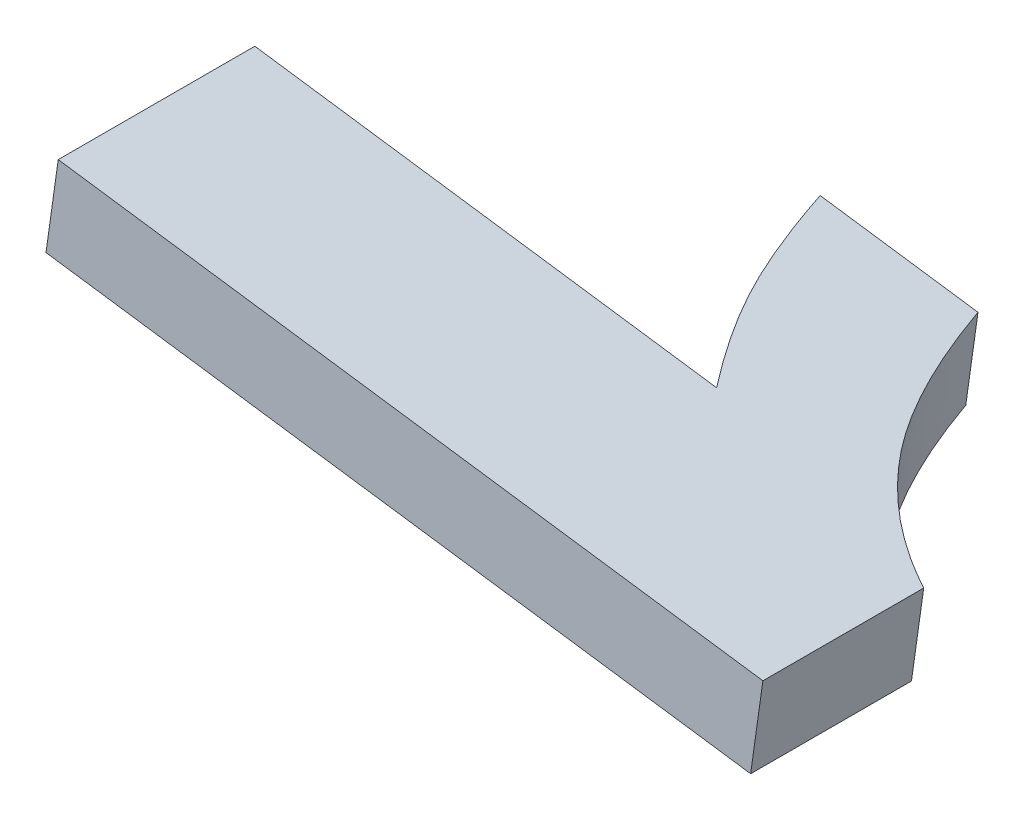
ISO-10303-21;
HEADER;
FILE_DESCRIPTION(('STEP AP214'),'2;1');
FILE_NAME('part.step','',(''),(''),'','','');
FILE_SCHEMA(('AUTOMOTIVE_DESIGN { 1 0 10303 214 1 1 1 1 }'));
ENDSEC;
DATA;
#1=APPLICATION_CONTEXT('core data for automotive mechanical design processes');
#2=APPLICATION_PROTOCOL_DEFINITION('international standard','automotive_design',2000,#1);
#3=PRODUCT_CONTEXT('',#1,'mechanical');
#4=PRODUCT('Part','Part','',(#3));
#5=PRODUCT_RELATED_PRODUCT_CATEGORY('part','',(#4));
#6=PRODUCT_DEFINITION_FORMATION('','',#4);
#7=PRODUCT_DEFINITION_CONTEXT('part definition',#1,'design');
#8=PRODUCT_DEFINITION('design','',#6,#7);
#9=PRODUCT_DEFINITION_SHAPE('','',#8);
#10=(LENGTH_UNIT() NAMED_UNIT(*) SI_UNIT(.MILLI.,.METRE.));
#11=(NAMED_UNIT(*) PLANE_ANGLE_UNIT() SI_UNIT($,.RADIAN.));
#12=(NAMED_UNIT(*) SI_UNIT($,.STERADIAN.) SOLID_ANGLE_UNIT());
#13=UNCERTAINTY_MEASURE_WITH_UNIT(LENGTH_MEASURE(1.E-05),#10,'distance_accuracy_value','');
#14=(GEOMETRIC_REPRESENTATION_CONTEXT(3) GLOBAL_UNCERTAINTY_ASSIGNED_CONTEXT((#13)) GLOBAL_UNIT_ASSIGNED_CONTEXT((#10,
#11,#12)) REPRESENTATION_CONTEXT('',''));
#15=CARTESIAN_POINT('',(0.,0.,0.));
#16=DIRECTION('',(0.,0.,1.));
#17=DIRECTION('',(1.,0.,0.));
#18=AXIS2_PLACEMENT_3D('',#15,#16,#17);
#19=CARTESIAN_POINT('',(885.132483996912,611.890650809925,2415.43359553753));
#20=DIRECTION('',(0.000106014336864524,0.000754331202662668,0.999999709872657));
#21=DIRECTION('',(0.990268068741567,-0.139173100960088,0.));
#22=AXIS2_PLACEMENT_3D('',#19,#20,#21);
#23=PLANE('',#22);
#24=CARTESIAN_POINT('',(883.74075339109,601.987972995548,2415.441212982));
#25=CARTESIAN_POINT('',(843.45454082646,607.64983093638,2415.441212982));
#26=CARTESIAN_POINT('',(803.168328261831,613.311688877212,2415.441212982));
#27=B_SPLINE_CURVE_WITH_KNOTS('',2,(#24,#25,#26),.UNSPECIFIED.,.F.,.F.,(3,3),(0.,1.),.UNSPECIFIED.);
#28=CARTESIAN_POINT('',(883.74075339109,601.987972995548,2415.441212982));
#29=VERTEX_POINT('',#28);
#30=CARTESIAN_POINT('',(803.168328261831,613.311688877212,2415.441212982));
#31=VERTEX_POINT('',#30);
#32=EDGE_CURVE('E190',#29,#31,#27,.T.);
#33=ORIENTED_EDGE('',*,*,#32,.F.);
#34=DIRECTION('',(-0.139173060582166,-0.990267781437723,0.000761744447259926));
#35=VECTOR('',#34,1.);
#36=CARTESIAN_POINT('',(885.132483996912,611.890650809925,2415.43359553753));
#37=LINE('',#36,#35);
#38=CARTESIAN_POINT('',(885.132483996912,611.890650809925,2415.43359553753));
#39=VERTEX_POINT('',#38);
#40=EDGE_CURVE('E33',#39,#29,#37,.T.);
#41=ORIENTED_EDGE('',*,*,#40,.F.);
#42=CARTESIAN_POINT('',(885.132483996912,611.890650809925,2415.43359553753));
#43=CARTESIAN_POINT('',(844.846271432282,617.552508750757,2415.43359553753));
#44=CARTESIAN_POINT('',(804.560058867652,623.214366691589,2415.43359553753));
#45=B_SPLINE_CURVE_WITH_KNOTS('',2,(#42,#43,#44),.UNSPECIFIED.,.F.,.F.,(3,3),(0.,1.),.UNSPECIFIED.);
#46=CARTESIAN_POINT('',(804.560058867652,623.214366691589,2415.43359553753));
#47=VERTEX_POINT('',#46);
#48=EDGE_CURVE('E149',#39,#47,#45,.T.);
#49=ORIENTED_EDGE('',*,*,#48,.T.);
#50=DIRECTION('',(-0.139173060582166,-0.990267781437723,0.000761744447259926));
#51=VECTOR('',#50,1.);
#52=CARTESIAN_POINT('',(804.560058867652,623.214366691589,2415.43359553753));
#53=LINE('',#52,#51);
#54=EDGE_CURVE('E11',#47,#31,#53,.T.);
#55=ORIENTED_EDGE('',*,*,#54,.T.);
#56=EDGE_LOOP('',(#33,#41,#49,#55));
#57=FACE_BOUND('',#56,.T.);
#58=ADVANCED_FACE('F17',(#57),#23,.T.);
#59=CARTESIAN_POINT('',(804.560058867652,623.214366691589,2415.43359553753));
#60=DIRECTION('',(-0.990268068741567,0.139173100960088,0.));
#61=DIRECTION('',(0.000106014336864968,0.000754331202662599,0.999999709872657));
#62=AXIS2_PLACEMENT_3D('',#59,#60,#61);
#63=PLANE('',#62);
#64=CARTESIAN_POINT('',(803.168328261831,613.311688877212,2415.441212982));
#65=CARTESIAN_POINT('',(803.167136504483,613.303209083065,2404.19974284646));
#66=CARTESIAN_POINT('',(803.165944747136,613.294729288917,2392.95827271092));
#67=B_SPLINE_CURVE_WITH_KNOTS('',2,(#64,#65,#66),.UNSPECIFIED.,.F.,.F.,(3,3),(1.,2.),.UNSPECIFIED.);
#68=CARTESIAN_POINT('',(803.165944747136,613.294729288917,2392.95827271092));
#69=VERTEX_POINT('',#68);
#70=EDGE_CURVE('E180',#31,#69,#67,.T.);
#71=ORIENTED_EDGE('',*,*,#70,.F.);
#72=ORIENTED_EDGE('',*,*,#54,.F.);
#73=CARTESIAN_POINT('',(804.560058867652,623.214366691589,2415.43359553753));
#74=CARTESIAN_POINT('',(804.558867110305,623.205886897442,2404.19212540198));
#75=CARTESIAN_POINT('',(804.557675352957,623.197407103295,2392.95065526645));
#76=B_SPLINE_CURVE_WITH_KNOTS('',2,(#73,#74,#75),.UNSPECIFIED.,.F.,.F.,(3,3),(1.,2.),.UNSPECIFIED.);
#77=CARTESIAN_POINT('',(804.557675352957,623.197407103295,2392.95065526645));
#78=VERTEX_POINT('',#77);
#79=EDGE_CURVE('E142',#47,#78,#76,.T.);
#80=ORIENTED_EDGE('',*,*,#79,.T.);
#81=DIRECTION('',(-0.139173060582166,-0.990267781437723,0.000761744447259926));
#82=VECTOR('',#81,1.);
#83=CARTESIAN_POINT('',(804.557675352957,623.197407103295,2392.95065526645));
#84=LINE('',#83,#82);
#85=EDGE_CURVE('E25',#78,#69,#84,.T.);
#86=ORIENTED_EDGE('',*,*,#85,.T.);
#87=EDGE_LOOP('',(#71,#72,#80,#86));
#88=FACE_BOUND('',#87,.T.);
#89=ADVANCED_FACE('F178',(#88),#63,.T.);
#90=CARTESIAN_POINT('',(804.557675352957,623.197407103295,2392.95065526645));
#91=DIRECTION('',(-0.000106014336859916,-0.000754331202663314,-0.999999709872657));
#92=DIRECTION('',(-0.990268068741567,0.139173100960088,0.));
#93=AXIS2_PLACEMENT_3D('',#90,#91,#92);
#94=PLANE('',#93);
#95=CARTESIAN_POINT('',(803.165944747136,613.294729288917,2392.95827271092));
#96=CARTESIAN_POINT('',(829.564086716044,609.584712382014,2392.95827271092));
#97=CARTESIAN_POINT('',(855.962228684953,605.874695475111,2392.95827271092));
#98=B_SPLINE_CURVE_WITH_KNOTS('',2,(#95,#96,#97),.UNSPECIFIED.,.F.,.F.,(3,3),(2.,3.),.UNSPECIFIED.);
#99=CARTESIAN_POINT('',(855.962228684953,605.874695475111,2392.95827271092));
#100=VERTEX_POINT('',#99);
#101=EDGE_CURVE('E184',#69,#100,#98,.T.);
#102=ORIENTED_EDGE('',*,*,#101,.F.);
#103=ORIENTED_EDGE('',*,*,#85,.F.);
#104=CARTESIAN_POINT('',(804.557675352957,623.197407103295,2392.95065526645));
#105=CARTESIAN_POINT('',(830.955817321866,619.487390196391,2392.95065526645));
#106=CARTESIAN_POINT('',(857.353959290775,615.777373289488,2392.95065526645));
#107=B_SPLINE_CURVE_WITH_KNOTS('',2,(#104,#105,#106),.UNSPECIFIED.,.F.,.F.,(3,3),(2.,3.),.UNSPECIFIED.);
#108=CARTESIAN_POINT('',(857.353959290775,615.777373289488,2392.95065526645));
#109=VERTEX_POINT('',#108);
#110=EDGE_CURVE('E134',#78,#109,#107,.T.);
#111=ORIENTED_EDGE('',*,*,#110,.T.);
#112=DIRECTION('',(-0.139173060582166,-0.990267781437723,0.000761744447259926));
#113=VECTOR('',#112,1.);
#114=CARTESIAN_POINT('',(857.353959290775,615.777373289488,2392.95065526645));
#115=LINE('',#114,#113);
#116=EDGE_CURVE('E176',#109,#100,#115,.T.);
#117=ORIENTED_EDGE('',*,*,#116,.T.);
#118=EDGE_LOOP('',(#102,#103,#111,#117));
#119=FACE_BOUND('',#118,.T.);
#120=ADVANCED_FACE('F128',(#119),#94,.T.);
#121=CARTESIAN_POINT('',(857.353959290775,615.777373289488,2392.95065526645));
#122=CARTESIAN_POINT('',(853.246402692792,616.350455011327,2387.49363092881));
#123=CARTESIAN_POINT('',(850.706020069525,616.703557645852,2382.39131317311));
#124=CARTESIAN_POINT('',(848.165637446259,617.056660280378,2377.28899541741));
#125=CARTESIAN_POINT('',(845.841136765365,617.377428773786,2369.59459110135));
#126=B_SPLINE_CURVE_WITH_KNOTS('',2,(#121,#122,#123,#124,#125),.UNSPECIFIED.,.F.,.F.,(3,2,3),
(3.,4.,5.),.UNSPECIFIED.);
#127=DIRECTION('',(-0.139173060582166,-0.990267781437723,0.000761744447259926));
#128=VECTOR('',#127,1.);
#129=SURFACE_OF_LINEAR_EXTRUSION('',#126,#128);
#130=CARTESIAN_POINT('',(855.962228684953,605.874695475111,2392.95827271092));
#131=CARTESIAN_POINT('',(851.85467208697,606.44777719695,2387.50124837328));
#132=CARTESIAN_POINT('',(849.314289463704,606.800879831475,2382.39893061758));
#133=CARTESIAN_POINT('',(846.773906840438,607.153982466,2377.29661286189));
#134=CARTESIAN_POINT('',(844.449406159544,607.474750959409,2369.60220854582));
#135=B_SPLINE_CURVE_WITH_KNOTS('',2,(#130,#131,#132,#133,#134),.UNSPECIFIED.,.F.,.F.,(3,2,3),
(3.,4.,5.),.UNSPECIFIED.);
#136=CARTESIAN_POINT('',(844.449406159544,607.474750959409,2369.60220854582));
#137=VERTEX_POINT('',#136);
#138=EDGE_CURVE('E187',#100,#137,#135,.T.);
#139=ORIENTED_EDGE('',*,*,#138,.F.);
#140=ORIENTED_EDGE('',*,*,#116,.F.);
#141=CARTESIAN_POINT('',(845.841136765365,617.377428773786,2369.59459110135));
#142=VERTEX_POINT('',#141);
#143=EDGE_CURVE('E98',#109,#142,#126,.T.);
#144=ORIENTED_EDGE('',*,*,#143,.T.);
#145=DIRECTION('',(-0.139173060582166,-0.990267781437723,0.000761744447259926));
#146=VECTOR('',#145,1.);
#147=CARTESIAN_POINT('',(845.841136765365,617.377428773786,2369.59459110135));
#148=LINE('',#147,#146);
#149=EDGE_CURVE('E90',#142,#137,#148,.T.);
#150=ORIENTED_EDGE('',*,*,#149,.T.);
#151=EDGE_LOOP('',(#139,#140,#144,#150));
#152=FACE_BOUND('',#151,.T.);
#153=ADVANCED_FACE('F125',(#152),#129,.T.);
#154=CARTESIAN_POINT('',(845.841136765365,617.377428773786,2369.59459110135));
#155=DIRECTION('',(-0.000106014336863636,-0.000754331202662793,-0.999999709872657));
#156=DIRECTION('',(-0.990268068741567,0.139173100960088,0.));
#157=AXIS2_PLACEMENT_3D('',#154,#155,#156);
#158=PLANE('',#157);
#159=CARTESIAN_POINT('',(844.449406159544,607.474750959409,2369.60220854582));
#160=CARTESIAN_POINT('',(853.473950087502,606.206434022965,2369.60220854582));
#161=CARTESIAN_POINT('',(862.498494015461,604.938117086521,2369.60220854582));
#162=B_SPLINE_CURVE_WITH_KNOTS('',2,(#159,#160,#161),.UNSPECIFIED.,.F.,.F.,(3,3),(5.,6.),.UNSPECIFIED.);
#163=CARTESIAN_POINT('',(862.498494015461,604.938117086521,2369.60220854582));
#164=VERTEX_POINT('',#163);
#165=EDGE_CURVE('E162',#137,#164,#162,.T.);
#166=ORIENTED_EDGE('',*,*,#165,.F.);
#167=ORIENTED_EDGE('',*,*,#149,.F.);
#168=CARTESIAN_POINT('',(845.841136765365,617.377428773786,2369.59459110135));
#169=CARTESIAN_POINT('',(854.865680693324,616.109111837342,2369.59459110135));
#170=CARTESIAN_POINT('',(863.890224621283,614.840794900898,2369.59459110135));
#171=B_SPLINE_CURVE_WITH_KNOTS('',2,(#168,#169,#170),.UNSPECIFIED.,.F.,.F.,(3,3),(5.,6.),.UNSPECIFIED.);
#172=CARTESIAN_POINT('',(863.890224621283,614.840794900898,2369.59459110135));
#173=VERTEX_POINT('',#172);
#174=EDGE_CURVE('E93',#142,#173,#171,.T.);
#175=ORIENTED_EDGE('',*,*,#174,.T.);
#176=DIRECTION('',(-0.139173060582166,-0.990267781437723,0.000761744447259926));
#177=VECTOR('',#176,1.);
#178=CARTESIAN_POINT('',(863.890224621283,614.840794900898,2369.59459110135));
#179=LINE('',#178,#177);
#180=EDGE_CURVE('E79',#173,#164,#179,.T.);
#181=ORIENTED_EDGE('',*,*,#180,.T.);
#182=EDGE_LOOP('',(#166,#167,#175,#181));
#183=FACE_BOUND('',#182,.T.);
#184=ADVANCED_FACE('F94',(#183),#158,.T.);
#185=CARTESIAN_POINT('',(863.890224621283,614.840794900898,2369.59459110135));
#186=CARTESIAN_POINT('',(867.512053357313,614.340511306128,2380.94520172364));
#187=CARTESIAN_POINT('',(872.592402067296,613.63134222553,2387.22077971192));
#188=CARTESIAN_POINT('',(877.67275077728,612.922173144933,2393.49635770021));
#189=CARTESIAN_POINT('',(885.130534374454,611.876778525325,2397.04342351968));
#190=B_SPLINE_CURVE_WITH_KNOTS('',2,(#185,#186,#187,#188,#189),.UNSPECIFIED.,.F.,.F.,(3,2,3),
(6.,7.,8.),.UNSPECIFIED.);
#191=DIRECTION('',(-0.139173060582166,-0.990267781437723,0.000761744447259926));
#192=VECTOR('',#191,1.);
#193=SURFACE_OF_LINEAR_EXTRUSION('',#190,#192);
#194=CARTESIAN_POINT('',(862.498494015461,604.938117086521,2369.60220854582));
#195=CARTESIAN_POINT('',(866.120322751491,604.43783349175,2380.95281916811));
#196=CARTESIAN_POINT('',(871.200671461474,603.728664411153,2387.2283971564));
#197=CARTESIAN_POINT('',(876.281020171458,603.019495330556,2393.50397514468));
#198=CARTESIAN_POINT('',(883.738803768633,601.974100710948,2397.05104096415));
#199=B_SPLINE_CURVE_WITH_KNOTS('',2,(#194,#195,#196,#197,#198),.UNSPECIFIED.,.F.,.F.,(3,2,3),
(6.,7.,8.),.UNSPECIFIED.);
#200=CARTESIAN_POINT('',(883.738803768633,601.974100710948,2397.05104096415));
#201=VERTEX_POINT('',#200);
#202=EDGE_CURVE('E86',#164,#201,#199,.T.);
#203=ORIENTED_EDGE('',*,*,#202,.F.);
#204=ORIENTED_EDGE('',*,*,#180,.F.);
#205=CARTESIAN_POINT('',(885.130534374454,611.876778525325,2397.04342351968));
#206=VERTEX_POINT('',#205);
#207=EDGE_CURVE('E83',#173,#206,#190,.T.);
#208=ORIENTED_EDGE('',*,*,#207,.T.);
#209=DIRECTION('',(-0.139173060582166,-0.990267781437723,0.000761744447259926));
#210=VECTOR('',#209,1.);
#211=CARTESIAN_POINT('',(885.130534374454,611.876778525325,2397.04342351968));
#212=LINE('',#211,#210);
#213=EDGE_CURVE('E58',#206,#201,#212,.T.);
#214=ORIENTED_EDGE('',*,*,#213,.T.);
#215=EDGE_LOOP('',(#203,#204,#208,#214));
#216=FACE_BOUND('',#215,.T.);
#217=ADVANCED_FACE('F81',(#216),#193,.T.);
#218=CARTESIAN_POINT('',(885.130534374454,611.876778525325,2397.04342351968));
#219=DIRECTION('',(0.990268068741567,-0.139173100960088,0.));
#220=DIRECTION('',(-0.000106014336874183,-0.000754331202661308,-0.999999709872657));
#221=AXIS2_PLACEMENT_3D('',#218,#219,#220);
#222=PLANE('',#221);
#223=CARTESIAN_POINT('',(883.738803768633,601.974100710948,2397.05104096415));
#224=CARTESIAN_POINT('',(883.739778579861,601.981036853248,2406.24612697308));
#225=CARTESIAN_POINT('',(883.74075339109,601.987972995548,2415.441212982));
#226=B_SPLINE_CURVE_WITH_KNOTS('',2,(#223,#224,#225),.UNSPECIFIED.,.F.,.F.,(3,3),(8.,9.),.UNSPECIFIED.);
#227=EDGE_CURVE('E155',#201,#29,#226,.T.);
#228=ORIENTED_EDGE('',*,*,#227,.F.);
#229=ORIENTED_EDGE('',*,*,#213,.F.);
#230=CARTESIAN_POINT('',(885.130534374454,611.876778525325,2397.04342351968));
#231=CARTESIAN_POINT('',(885.131509185683,611.883714667625,2406.2385095286));
#232=CARTESIAN_POINT('',(885.132483996912,611.890650809925,2415.43359553753));
#233=B_SPLINE_CURVE_WITH_KNOTS('',2,(#230,#231,#232),.UNSPECIFIED.,.F.,.F.,(3,3),(8.,9.),.UNSPECIFIED.);
#234=EDGE_CURVE('E102',#206,#39,#233,.T.);
#235=ORIENTED_EDGE('',*,*,#234,.T.);
#236=ORIENTED_EDGE('',*,*,#40,.T.);
#237=EDGE_LOOP('',(#228,#229,#235,#236));
#238=FACE_BOUND('',#237,.T.);
#239=ADVANCED_FACE('F121',(#238),#222,.T.);
#240=CARTESIAN_POINT('',(850.706020069525,616.703557645852,2382.39131317311));
#241=DIRECTION('',(0.139173060582328,0.9902677814377,-0.000761744447363933));
#242=DIRECTION('',(0.286420824998816,-0.0409901500377052,-0.957226680889581));
#243=AXIS2_PLACEMENT_3D('',#240,#241,#242);
#244=PLANE('',#243);
#245=ORIENTED_EDGE('',*,*,#48,.F.);
#246=ORIENTED_EDGE('',*,*,#234,.F.);
#247=ORIENTED_EDGE('',*,*,#207,.F.);
#248=ORIENTED_EDGE('',*,*,#174,.F.);
#249=ORIENTED_EDGE('',*,*,#143,.F.);
#250=ORIENTED_EDGE('',*,*,#110,.F.);
#251=ORIENTED_EDGE('',*,*,#79,.F.);
#252=EDGE_LOOP('',(#245,#246,#247,#248,#249,#250,#251));
#253=FACE_BOUND('',#252,.T.);
#254=ADVANCED_FACE('F101',(#253),#244,.T.);
#255=CARTESIAN_POINT('',(849.314289463704,606.800879831475,2382.39893061758));
#256=DIRECTION('',(0.139173060582328,0.9902677814377,-0.000761744447363933));
#257=DIRECTION('',(0.286420824998816,-0.0409901500377052,-0.957226680889581));
#258=AXIS2_PLACEMENT_3D('',#255,#256,#257);
#259=PLANE('',#258);
#260=ORIENTED_EDGE('',*,*,#32,.T.);
#261=ORIENTED_EDGE('',*,*,#70,.T.);
#262=ORIENTED_EDGE('',*,*,#101,.T.);
#263=ORIENTED_EDGE('',*,*,#138,.T.);
#264=ORIENTED_EDGE('',*,*,#165,.T.);
#265=ORIENTED_EDGE('',*,*,#202,.T.);
#266=ORIENTED_EDGE('',*,*,#227,.T.);
#267=EDGE_LOOP('',(#260,#261,#262,#263,#264,#265,#266));
#268=FACE_BOUND('',#267,.T.);
#269=ADVANCED_FACE('F189',(#268),#259,.F.);
#270=CLOSED_SHELL('',(#58,#89,#120,#153,#184,#217,#239,#254,#269));
#271=MANIFOLD_SOLID_BREP('B1',#270);
#272=ADVANCED_BREP_SHAPE_REPRESENTATION('',(#18,#271),#14);
#273=SHAPE_DEFINITION_REPRESENTATION(#9,#272);
ENDSEC;
END-ISO-10303-21;
